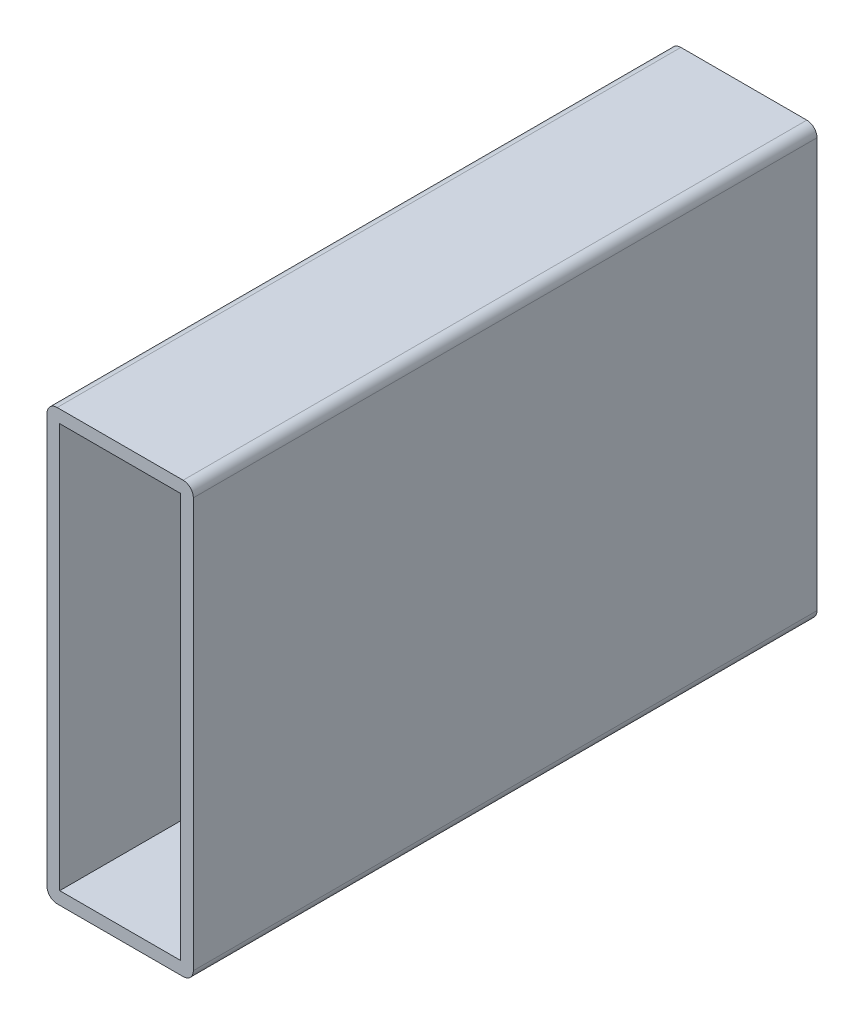
ISO-10303-21;
HEADER;
FILE_DESCRIPTION(('STEP AP214'),'2;1');
FILE_NAME('part.step','',(''),(''),'','','');
FILE_SCHEMA(('AUTOMOTIVE_DESIGN { 1 0 10303 214 1 1 1 1 }'));
ENDSEC;
DATA;
#1=APPLICATION_CONTEXT('core data for automotive mechanical design processes');
#2=APPLICATION_PROTOCOL_DEFINITION('international standard','automotive_design',2000,#1);
#3=PRODUCT_CONTEXT('',#1,'mechanical');
#4=PRODUCT('Part','Part','',(#3));
#5=PRODUCT_RELATED_PRODUCT_CATEGORY('part','',(#4));
#6=PRODUCT_DEFINITION_FORMATION('','',#4);
#7=PRODUCT_DEFINITION_CONTEXT('part definition',#1,'design');
#8=PRODUCT_DEFINITION('design','',#6,#7);
#9=PRODUCT_DEFINITION_SHAPE('','',#8);
#10=(LENGTH_UNIT() NAMED_UNIT(*) SI_UNIT(.MILLI.,.METRE.));
#11=(NAMED_UNIT(*) PLANE_ANGLE_UNIT() SI_UNIT($,.RADIAN.));
#12=(NAMED_UNIT(*) SI_UNIT($,.STERADIAN.) SOLID_ANGLE_UNIT());
#13=UNCERTAINTY_MEASURE_WITH_UNIT(LENGTH_MEASURE(1.E-05),#10,'distance_accuracy_value','');
#14=(GEOMETRIC_REPRESENTATION_CONTEXT(3) GLOBAL_UNCERTAINTY_ASSIGNED_CONTEXT((#13)) GLOBAL_UNIT_ASSIGNED_CONTEXT((#10,
#11,#12)) REPRESENTATION_CONTEXT('',''));
#15=CARTESIAN_POINT('',(0.,0.,0.));
#16=DIRECTION('',(0.,0.,1.));
#17=DIRECTION('',(1.,0.,0.));
#18=AXIS2_PLACEMENT_3D('',#15,#16,#17);
#19=CARTESIAN_POINT('',(36.5,0.,0.));
#20=DIRECTION('',(0.,0.,-1.));
#21=DIRECTION('',(-1.,0.,0.));
#22=AXIS2_PLACEMENT_3D('',#19,#20,#21);
#23=PLANE('',#22);
#24=DIRECTION('',(-1.,0.,0.));
#25=VECTOR('',#24,1.);
#26=CARTESIAN_POINT('',(36.5,0.,0.));
#27=LINE('',#26,#25);
#28=CARTESIAN_POINT('',(33.96,0.,0.));
#29=VERTEX_POINT('',#28);
#30=CARTESIAN_POINT('',(2.54,0.,0.));
#31=VERTEX_POINT('',#30);
#32=EDGE_CURVE('E251',#29,#31,#27,.T.);
#33=ORIENTED_EDGE('',*,*,#32,.F.);
#34=CARTESIAN_POINT('',(33.96,2.54,0.));
#35=DIRECTION('',(0.,0.,-1.));
#36=DIRECTION('',(-1.,0.,0.));
#37=AXIS2_PLACEMENT_3D('',#34,#35,#36);
#38=CIRCLE('',#37,2.54);
#39=CARTESIAN_POINT('',(36.5,2.54,0.));
#40=VERTEX_POINT('',#39);
#41=EDGE_CURVE('E279',#29,#40,#38,.F.);
#42=ORIENTED_EDGE('',*,*,#41,.T.);
#43=DIRECTION('',(0.,-1.,0.));
#44=VECTOR('',#43,1.);
#45=CARTESIAN_POINT('',(36.5,0.,0.));
#46=LINE('',#45,#44);
#47=CARTESIAN_POINT('',(36.5,104.697500028,0.));
#48=VERTEX_POINT('',#47);
#49=EDGE_CURVE('E231',#48,#40,#46,.T.);
#50=ORIENTED_EDGE('',*,*,#49,.F.);
#51=CARTESIAN_POINT('',(33.96,104.697500028,0.));
#52=DIRECTION('',(0.,0.,-1.));
#53=DIRECTION('',(-1.,0.,0.));
#54=AXIS2_PLACEMENT_3D('',#51,#52,#53);
#55=CIRCLE('',#54,2.54);
#56=CARTESIAN_POINT('',(33.96,107.237500028,0.));
#57=VERTEX_POINT('',#56);
#58=EDGE_CURVE('E273',#48,#57,#55,.F.);
#59=ORIENTED_EDGE('',*,*,#58,.T.);
#60=DIRECTION('',(-1.,0.,0.));
#61=VECTOR('',#60,1.);
#62=CARTESIAN_POINT('',(36.5,107.237500028,0.));
#63=LINE('',#62,#61);
#64=CARTESIAN_POINT('',(2.54,107.237500028,0.));
#65=VERTEX_POINT('',#64);
#66=EDGE_CURVE('E238',#57,#65,#63,.T.);
#67=ORIENTED_EDGE('',*,*,#66,.T.);
#68=CARTESIAN_POINT('',(2.54,104.697500028,0.));
#69=DIRECTION('',(0.,0.,-1.));
#70=DIRECTION('',(-1.,0.,0.));
#71=AXIS2_PLACEMENT_3D('',#68,#69,#70);
#72=CIRCLE('',#71,2.54);
#73=CARTESIAN_POINT('',(0.,104.697500028,0.));
#74=VERTEX_POINT('',#73);
#75=EDGE_CURVE('E275',#65,#74,#72,.F.);
#76=ORIENTED_EDGE('',*,*,#75,.T.);
#77=DIRECTION('',(0.,-1.,0.));
#78=VECTOR('',#77,1.);
#79=CARTESIAN_POINT('',(0.,0.,0.));
#80=LINE('',#79,#78);
#81=CARTESIAN_POINT('',(0.,2.54,0.));
#82=VERTEX_POINT('',#81);
#83=EDGE_CURVE('E224',#74,#82,#80,.T.);
#84=ORIENTED_EDGE('',*,*,#83,.T.);
#85=CARTESIAN_POINT('',(2.54,2.54,0.));
#86=DIRECTION('',(0.,0.,-1.));
#87=DIRECTION('',(-1.,0.,0.));
#88=AXIS2_PLACEMENT_3D('',#85,#86,#87);
#89=CIRCLE('',#88,2.54);
#90=EDGE_CURVE('E277',#82,#31,#89,.F.);
#91=ORIENTED_EDGE('',*,*,#90,.T.);
#92=EDGE_LOOP('',(#33,#42,#50,#59,#67,#76,#84,#91));
#93=FACE_BOUND('',#92,.T.);
#94=DIRECTION('',(0.,-1.,0.));
#95=VECTOR('',#94,1.);
#96=CARTESIAN_POINT('',(3.175,0.,0.));
#97=LINE('',#96,#95);
#98=CARTESIAN_POINT('',(3.175,104.062500028,0.));
#99=VERTEX_POINT('',#98);
#100=CARTESIAN_POINT('',(3.175,3.175,0.));
#101=VERTEX_POINT('',#100);
#102=EDGE_CURVE('E158',#99,#101,#97,.T.);
#103=ORIENTED_EDGE('',*,*,#102,.F.);
#104=DIRECTION('',(-1.,0.,0.));
#105=VECTOR('',#104,1.);
#106=CARTESIAN_POINT('',(36.5,104.062500028,0.));
#107=LINE('',#106,#105);
#108=CARTESIAN_POINT('',(33.325,104.062500028,0.));
#109=VERTEX_POINT('',#108);
#110=EDGE_CURVE('E216',#109,#99,#107,.T.);
#111=ORIENTED_EDGE('',*,*,#110,.F.);
#112=DIRECTION('',(0.,-1.,0.));
#113=VECTOR('',#112,1.);
#114=CARTESIAN_POINT('',(33.325,0.,0.));
#115=LINE('',#114,#113);
#116=CARTESIAN_POINT('',(33.325,3.175,0.));
#117=VERTEX_POINT('',#116);
#118=EDGE_CURVE('E211',#109,#117,#115,.T.);
#119=ORIENTED_EDGE('',*,*,#118,.T.);
#120=DIRECTION('',(-1.,0.,0.));
#121=VECTOR('',#120,1.);
#122=CARTESIAN_POINT('',(36.5,3.175,0.));
#123=LINE('',#122,#121);
#124=EDGE_CURVE('E206',#117,#101,#123,.T.);
#125=ORIENTED_EDGE('',*,*,#124,.T.);
#126=EDGE_LOOP('',(#103,#111,#119,#125));
#127=FACE_BOUND('',#126,.T.);
#128=ADVANCED_FACE('F39',(#93,#127),#23,.F.);
#129=CARTESIAN_POINT('',(36.5,0.,0.));
#130=DIRECTION('',(0.,1.,0.));
#131=DIRECTION('',(0.,0.,1.));
#132=AXIS2_PLACEMENT_3D('',#129,#130,#131);
#133=PLANE('',#132);
#134=DIRECTION('',(-1.,0.,0.));
#135=VECTOR('',#134,1.);
#136=CARTESIAN_POINT('',(36.5,0.,-155.575));
#137=LINE('',#136,#135);
#138=CARTESIAN_POINT('',(33.96,0.,-155.575));
#139=VERTEX_POINT('',#138);
#140=CARTESIAN_POINT('',(2.54,0.,-155.575));
#141=VERTEX_POINT('',#140);
#142=EDGE_CURVE('E248',#139,#141,#137,.T.);
#143=ORIENTED_EDGE('',*,*,#142,.F.);
#144=DIRECTION('',(0.,0.,-1.));
#145=VECTOR('',#144,1.);
#146=CARTESIAN_POINT('',(33.96,0.,0.));
#147=LINE('',#146,#145);
#148=EDGE_CURVE('E271',#139,#29,#147,.F.);
#149=ORIENTED_EDGE('',*,*,#148,.T.);
#150=ORIENTED_EDGE('',*,*,#32,.T.);
#151=DIRECTION('',(0.,0.,-1.));
#152=VECTOR('',#151,1.);
#153=CARTESIAN_POINT('',(2.54,0.,-155.575));
#154=LINE('',#153,#152);
#155=EDGE_CURVE('E268',#31,#141,#154,.T.);
#156=ORIENTED_EDGE('',*,*,#155,.T.);
#157=EDGE_LOOP('',(#143,#149,#150,#156));
#158=FACE_BOUND('',#157,.T.);
#159=ADVANCED_FACE('F310',(#158),#133,.F.);
#160=CARTESIAN_POINT('',(36.5,0.,-155.575));
#161=DIRECTION('',(0.,0.,1.));
#162=DIRECTION('',(1.,0.,0.));
#163=AXIS2_PLACEMENT_3D('',#160,#161,#162);
#164=PLANE('',#163);
#165=CARTESIAN_POINT('',(7.175,25.4,-155.575));
#166=DIRECTION('',(0.,0.,1.));
#167=DIRECTION('',(1.,0.,0.));
#168=AXIS2_PLACEMENT_3D('',#165,#166,#167);
#169=CIRCLE('',#168,2.38125);
#170=CARTESIAN_POINT('',(9.55625,25.4,-155.575));
#171=VERTEX_POINT('',#170);
#172=EDGE_CURVE('E199',#171,#171,#169,.T.);
#173=ORIENTED_EDGE('',*,*,#172,.T.);
#174=EDGE_LOOP('',(#173));
#175=FACE_BOUND('',#174,.T.);
#176=DIRECTION('',(1.,0.,0.));
#177=VECTOR('',#176,1.);
#178=CARTESIAN_POINT('',(13.175,35.,-155.575));
#179=LINE('',#178,#177);
#180=CARTESIAN_POINT('',(13.175,35.,-155.575));
#181=VERTEX_POINT('',#180);
#182=CARTESIAN_POINT('',(28.175,35.,-155.575));
#183=VERTEX_POINT('',#182);
#184=EDGE_CURVE('E171',#181,#183,#179,.T.);
#185=ORIENTED_EDGE('',*,*,#184,.F.);
#186=DIRECTION('',(0.,1.,0.));
#187=VECTOR('',#186,1.);
#188=CARTESIAN_POINT('',(13.175,35.,-155.575));
#189=LINE('',#188,#187);
#190=CARTESIAN_POINT('',(13.175,20.,-155.575));
#191=VERTEX_POINT('',#190);
#192=EDGE_CURVE('E54',#191,#181,#189,.T.);
#193=ORIENTED_EDGE('',*,*,#192,.F.);
#194=DIRECTION('',(-1.,0.,0.));
#195=VECTOR('',#194,1.);
#196=CARTESIAN_POINT('',(13.175,20.,-155.575));
#197=LINE('',#196,#195);
#198=CARTESIAN_POINT('',(28.175,20.,-155.575));
#199=VERTEX_POINT('',#198);
#200=EDGE_CURVE('E164',#199,#191,#197,.T.);
#201=ORIENTED_EDGE('',*,*,#200,.F.);
#202=DIRECTION('',(0.,-1.,0.));
#203=VECTOR('',#202,1.);
#204=CARTESIAN_POINT('',(28.175,35.,-155.575));
#205=LINE('',#204,#203);
#206=EDGE_CURVE('E178',#183,#199,#205,.T.);
#207=ORIENTED_EDGE('',*,*,#206,.F.);
#208=EDGE_LOOP('',(#185,#193,#201,#207));
#209=FACE_BOUND('',#208,.T.);
#210=CARTESIAN_POINT('',(7.175,30.,-155.575));
#211=DIRECTION('',(0.,0.,-1.));
#212=DIRECTION('',(-1.,0.,0.));
#213=AXIS2_PLACEMENT_3D('',#210,#211,#212);
#214=CIRCLE('',#213,1.19999999999999);
#215=CARTESIAN_POINT('',(5.97500000000001,30.,-155.575));
#216=VERTEX_POINT('',#215);
#217=EDGE_CURVE('E190',#216,#216,#214,.T.);
#218=ORIENTED_EDGE('',*,*,#217,.F.);
#219=EDGE_LOOP('',(#218));
#220=FACE_BOUND('',#219,.T.);
#221=CARTESIAN_POINT('',(7.175,4.99999999999999,-155.575));
#222=DIRECTION('',(0.,0.,-1.));
#223=DIRECTION('',(-1.,0.,0.));
#224=AXIS2_PLACEMENT_3D('',#221,#222,#223);
#225=CIRCLE('',#224,1.19999999999999);
#226=CARTESIAN_POINT('',(5.97500000000001,4.99999999999999,-155.575));
#227=VERTEX_POINT('',#226);
#228=EDGE_CURVE('E196',#227,#227,#225,.T.);
#229=ORIENTED_EDGE('',*,*,#228,.F.);
#230=EDGE_LOOP('',(#229));
#231=FACE_BOUND('',#230,.T.);
#232=DIRECTION('',(0.,1.,0.));
#233=VECTOR('',#232,1.);
#234=CARTESIAN_POINT('',(36.5,0.,-155.575));
#235=LINE('',#234,#233);
#236=CARTESIAN_POINT('',(36.5,2.54,-155.575));
#237=VERTEX_POINT('',#236);
#238=CARTESIAN_POINT('',(36.5,104.697500028,-155.575));
#239=VERTEX_POINT('',#238);
#240=EDGE_CURVE('E234',#237,#239,#235,.T.);
#241=ORIENTED_EDGE('',*,*,#240,.F.);
#242=CARTESIAN_POINT('',(33.96,2.54,-155.575));
#243=DIRECTION('',(0.,0.,1.));
#244=DIRECTION('',(1.,0.,0.));
#245=AXIS2_PLACEMENT_3D('',#242,#243,#244);
#246=CIRCLE('',#245,2.54);
#247=EDGE_CURVE('E266',#237,#139,#246,.F.);
#248=ORIENTED_EDGE('',*,*,#247,.T.);
#249=ORIENTED_EDGE('',*,*,#142,.T.);
#250=CARTESIAN_POINT('',(2.54,2.54,-155.575));
#251=DIRECTION('',(0.,0.,1.));
#252=DIRECTION('',(1.,0.,0.));
#253=AXIS2_PLACEMENT_3D('',#250,#251,#252);
#254=CIRCLE('',#253,2.54);
#255=CARTESIAN_POINT('',(0.,2.54,-155.575));
#256=VERTEX_POINT('',#255);
#257=EDGE_CURVE('E264',#141,#256,#254,.F.);
#258=ORIENTED_EDGE('',*,*,#257,.T.);
#259=DIRECTION('',(0.,1.,0.));
#260=VECTOR('',#259,1.);
#261=CARTESIAN_POINT('',(0.,0.,-155.575));
#262=LINE('',#261,#260);
#263=CARTESIAN_POINT('',(0.,104.697500028,-155.575));
#264=VERTEX_POINT('',#263);
#265=EDGE_CURVE('E235',#256,#264,#262,.T.);
#266=ORIENTED_EDGE('',*,*,#265,.T.);
#267=CARTESIAN_POINT('',(2.54,104.697500028,-155.575));
#268=DIRECTION('',(0.,0.,1.));
#269=DIRECTION('',(1.,0.,0.));
#270=AXIS2_PLACEMENT_3D('',#267,#268,#269);
#271=CIRCLE('',#270,2.54);
#272=CARTESIAN_POINT('',(2.54,107.237500028,-155.575));
#273=VERTEX_POINT('',#272);
#274=EDGE_CURVE('E262',#264,#273,#271,.F.);
#275=ORIENTED_EDGE('',*,*,#274,.T.);
#276=DIRECTION('',(-1.,0.,0.));
#277=VECTOR('',#276,1.);
#278=CARTESIAN_POINT('',(36.5,107.237500028,-155.575));
#279=LINE('',#278,#277);
#280=CARTESIAN_POINT('',(33.96,107.237500028,-155.575));
#281=VERTEX_POINT('',#280);
#282=EDGE_CURVE('E245',#281,#273,#279,.T.);
#283=ORIENTED_EDGE('',*,*,#282,.F.);
#284=CARTESIAN_POINT('',(33.96,104.697500028,-155.575));
#285=DIRECTION('',(0.,0.,1.));
#286=DIRECTION('',(1.,0.,0.));
#287=AXIS2_PLACEMENT_3D('',#284,#285,#286);
#288=CIRCLE('',#287,2.54);
#289=EDGE_CURVE('E260',#281,#239,#288,.F.);
#290=ORIENTED_EDGE('',*,*,#289,.T.);
#291=EDGE_LOOP('',(#241,#248,#249,#258,#266,#275,#283,#290));
#292=FACE_BOUND('',#291,.T.);
#293=ADVANCED_FACE('F294',(#175,#209,#220,#231,#292),#164,.F.);
#294=CARTESIAN_POINT('',(36.5,107.237500028,0.));
#295=DIRECTION('',(0.,-1.,0.));
#296=DIRECTION('',(0.,0.,-1.));
#297=AXIS2_PLACEMENT_3D('',#294,#295,#296);
#298=PLANE('',#297);
#299=ORIENTED_EDGE('',*,*,#282,.T.);
#300=DIRECTION('',(0.,0.,1.));
#301=VECTOR('',#300,1.);
#302=CARTESIAN_POINT('',(2.54,107.237500028,0.));
#303=LINE('',#302,#301);
#304=EDGE_CURVE('E11',#273,#65,#303,.T.);
#305=ORIENTED_EDGE('',*,*,#304,.T.);
#306=ORIENTED_EDGE('',*,*,#66,.F.);
#307=DIRECTION('',(0.,0.,1.));
#308=VECTOR('',#307,1.);
#309=CARTESIAN_POINT('',(33.96,107.237500028,0.));
#310=LINE('',#309,#308);
#311=EDGE_CURVE('E47',#57,#281,#310,.F.);
#312=ORIENTED_EDGE('',*,*,#311,.T.);
#313=EDGE_LOOP('',(#299,#305,#306,#312));
#314=FACE_BOUND('',#313,.T.);
#315=ADVANCED_FACE('F288',(#314),#298,.F.);
#316=CARTESIAN_POINT('',(36.5,0.,0.));
#317=DIRECTION('',(-1.,0.,0.));
#318=DIRECTION('',(0.,0.,1.));
#319=AXIS2_PLACEMENT_3D('',#316,#317,#318);
#320=PLANE('',#319);
#321=ORIENTED_EDGE('',*,*,#49,.T.);
#322=DIRECTION('',(0.,0.,-1.));
#323=VECTOR('',#322,1.);
#324=CARTESIAN_POINT('',(36.5,2.54,0.));
#325=LINE('',#324,#323);
#326=EDGE_CURVE('E257',#40,#237,#325,.T.);
#327=ORIENTED_EDGE('',*,*,#326,.T.);
#328=ORIENTED_EDGE('',*,*,#240,.T.);
#329=DIRECTION('',(0.,0.,1.));
#330=VECTOR('',#329,1.);
#331=CARTESIAN_POINT('',(36.5,104.697500028,0.));
#332=LINE('',#331,#330);
#333=EDGE_CURVE('E254',#239,#48,#332,.T.);
#334=ORIENTED_EDGE('',*,*,#333,.T.);
#335=EDGE_LOOP('',(#321,#327,#328,#334));
#336=FACE_BOUND('',#335,.T.);
#337=ADVANCED_FACE('F299',(#336),#320,.F.);
#338=CARTESIAN_POINT('',(0.,0.,0.));
#339=DIRECTION('',(-1.,0.,0.));
#340=DIRECTION('',(0.,0.,1.));
#341=AXIS2_PLACEMENT_3D('',#338,#339,#340);
#342=PLANE('',#341);
#343=ORIENTED_EDGE('',*,*,#265,.F.);
#344=DIRECTION('',(0.,0.,-1.));
#345=VECTOR('',#344,1.);
#346=CARTESIAN_POINT('',(0.,2.54,0.));
#347=LINE('',#346,#345);
#348=EDGE_CURVE('E283',#256,#82,#347,.F.);
#349=ORIENTED_EDGE('',*,*,#348,.T.);
#350=ORIENTED_EDGE('',*,*,#83,.F.);
#351=DIRECTION('',(0.,0.,1.));
#352=VECTOR('',#351,1.);
#353=CARTESIAN_POINT('',(0.,104.697500028,-155.575));
#354=LINE('',#353,#352);
#355=EDGE_CURVE('E281',#74,#264,#354,.F.);
#356=ORIENTED_EDGE('',*,*,#355,.T.);
#357=EDGE_LOOP('',(#343,#349,#350,#356));
#358=FACE_BOUND('',#357,.T.);
#359=ADVANCED_FACE('F318',(#358),#342,.T.);
#360=CARTESIAN_POINT('',(36.5,3.175,0.));
#361=DIRECTION('',(0.,1.,0.));
#362=DIRECTION('',(0.,0.,1.));
#363=AXIS2_PLACEMENT_3D('',#360,#361,#362);
#364=PLANE('',#363);
#365=DIRECTION('',(0.,0.,-1.));
#366=VECTOR('',#365,1.);
#367=CARTESIAN_POINT('',(3.175,3.175,0.));
#368=LINE('',#367,#366);
#369=CARTESIAN_POINT('',(3.175,3.175,-152.4));
#370=VERTEX_POINT('',#369);
#371=EDGE_CURVE('E200',#101,#370,#368,.T.);
#372=ORIENTED_EDGE('',*,*,#371,.F.);
#373=ORIENTED_EDGE('',*,*,#124,.F.);
#374=DIRECTION('',(0.,0.,-1.));
#375=VECTOR('',#374,1.);
#376=CARTESIAN_POINT('',(33.325,3.175,0.));
#377=LINE('',#376,#375);
#378=CARTESIAN_POINT('',(33.325,3.175,-152.4));
#379=VERTEX_POINT('',#378);
#380=EDGE_CURVE('E208',#117,#379,#377,.T.);
#381=ORIENTED_EDGE('',*,*,#380,.T.);
#382=DIRECTION('',(-1.,0.,0.));
#383=VECTOR('',#382,1.);
#384=CARTESIAN_POINT('',(36.5,3.175,-152.4));
#385=LINE('',#384,#383);
#386=EDGE_CURVE('E203',#379,#370,#385,.T.);
#387=ORIENTED_EDGE('',*,*,#386,.T.);
#388=EDGE_LOOP('',(#372,#373,#381,#387));
#389=FACE_BOUND('',#388,.T.);
#390=ADVANCED_FACE('F358',(#389),#364,.T.);
#391=CARTESIAN_POINT('',(36.5,0.,-152.4));
#392=DIRECTION('',(0.,0.,1.));
#393=DIRECTION('',(1.,0.,0.));
#394=AXIS2_PLACEMENT_3D('',#391,#392,#393);
#395=PLANE('',#394);
#396=CARTESIAN_POINT('',(7.175,25.4,-152.4));
#397=DIRECTION('',(0.,0.,1.));
#398=DIRECTION('',(1.,0.,0.));
#399=AXIS2_PLACEMENT_3D('',#396,#397,#398);
#400=CIRCLE('',#399,2.38125);
#401=CARTESIAN_POINT('',(9.55625,25.4,-152.4));
#402=VERTEX_POINT('',#401);
#403=EDGE_CURVE('E540',#402,#402,#400,.T.);
#404=ORIENTED_EDGE('',*,*,#403,.F.);
#405=EDGE_LOOP('',(#404));
#406=FACE_BOUND('',#405,.T.);
#407=DIRECTION('',(0.,1.,0.));
#408=VECTOR('',#407,1.);
#409=CARTESIAN_POINT('',(13.175,35.,-152.4));
#410=LINE('',#409,#408);
#411=CARTESIAN_POINT('',(13.175,20.,-152.4));
#412=VERTEX_POINT('',#411);
#413=CARTESIAN_POINT('',(13.175,35.,-152.4));
#414=VERTEX_POINT('',#413);
#415=EDGE_CURVE('E162',#412,#414,#410,.T.);
#416=ORIENTED_EDGE('',*,*,#415,.T.);
#417=DIRECTION('',(1.,0.,0.));
#418=VECTOR('',#417,1.);
#419=CARTESIAN_POINT('',(13.175,35.,-152.4));
#420=LINE('',#419,#418);
#421=CARTESIAN_POINT('',(28.175,35.,-152.4));
#422=VERTEX_POINT('',#421);
#423=EDGE_CURVE('E151',#414,#422,#420,.T.);
#424=ORIENTED_EDGE('',*,*,#423,.T.);
#425=DIRECTION('',(0.,-1.,0.));
#426=VECTOR('',#425,1.);
#427=CARTESIAN_POINT('',(28.175,35.,-152.4));
#428=LINE('',#427,#426);
#429=CARTESIAN_POINT('',(28.175,20.,-152.4));
#430=VERTEX_POINT('',#429);
#431=EDGE_CURVE('E173',#422,#430,#428,.T.);
#432=ORIENTED_EDGE('',*,*,#431,.T.);
#433=DIRECTION('',(-1.,0.,0.));
#434=VECTOR('',#433,1.);
#435=CARTESIAN_POINT('',(13.175,20.,-152.4));
#436=LINE('',#435,#434);
#437=EDGE_CURVE('E169',#430,#412,#436,.T.);
#438=ORIENTED_EDGE('',*,*,#437,.T.);
#439=EDGE_LOOP('',(#416,#424,#432,#438));
#440=FACE_BOUND('',#439,.T.);
#441=CARTESIAN_POINT('',(7.175,30.,-152.4));
#442=DIRECTION('',(0.,0.,1.));
#443=DIRECTION('',(1.,0.,0.));
#444=AXIS2_PLACEMENT_3D('',#441,#442,#443);
#445=CIRCLE('',#444,1.19999999999999);
#446=CARTESIAN_POINT('',(8.37499999999999,30.,-152.4));
#447=VERTEX_POINT('',#446);
#448=EDGE_CURVE('E187',#447,#447,#445,.F.);
#449=ORIENTED_EDGE('',*,*,#448,.T.);
#450=EDGE_LOOP('',(#449));
#451=FACE_BOUND('',#450,.T.);
#452=CARTESIAN_POINT('',(7.175,4.99999999999999,-152.4));
#453=DIRECTION('',(0.,0.,1.));
#454=DIRECTION('',(1.,0.,0.));
#455=AXIS2_PLACEMENT_3D('',#452,#453,#454);
#456=CIRCLE('',#455,1.19999999999999);
#457=CARTESIAN_POINT('',(8.37499999999998,4.99999999999999,-152.4));
#458=VERTEX_POINT('',#457);
#459=EDGE_CURVE('E193',#458,#458,#456,.F.);
#460=ORIENTED_EDGE('',*,*,#459,.T.);
#461=EDGE_LOOP('',(#460));
#462=FACE_BOUND('',#461,.T.);
#463=DIRECTION('',(0.,1.,0.));
#464=VECTOR('',#463,1.);
#465=CARTESIAN_POINT('',(3.175,0.,-152.4));
#466=LINE('',#465,#464);
#467=CARTESIAN_POINT('',(3.175,104.062500028,-152.4));
#468=VERTEX_POINT('',#467);
#469=EDGE_CURVE('E202',#370,#468,#466,.T.);
#470=ORIENTED_EDGE('',*,*,#469,.F.);
#471=ORIENTED_EDGE('',*,*,#386,.F.);
#472=DIRECTION('',(0.,1.,0.));
#473=VECTOR('',#472,1.);
#474=CARTESIAN_POINT('',(33.325,0.,-152.4));
#475=LINE('',#474,#473);
#476=CARTESIAN_POINT('',(33.325,104.062500028,-152.4));
#477=VERTEX_POINT('',#476);
#478=EDGE_CURVE('E210',#379,#477,#475,.T.);
#479=ORIENTED_EDGE('',*,*,#478,.T.);
#480=DIRECTION('',(-1.,0.,0.));
#481=VECTOR('',#480,1.);
#482=CARTESIAN_POINT('',(36.5,104.062500028,-152.4));
#483=LINE('',#482,#481);
#484=EDGE_CURVE('E207',#477,#468,#483,.T.);
#485=ORIENTED_EDGE('',*,*,#484,.T.);
#486=EDGE_LOOP('',(#470,#471,#479,#485));
#487=FACE_BOUND('',#486,.T.);
#488=ADVANCED_FACE('F167',(#406,#440,#451,#462,#487),#395,.T.);
#489=CARTESIAN_POINT('',(36.5,104.062500028,0.));
#490=DIRECTION('',(0.,-1.,0.));
#491=DIRECTION('',(0.,0.,-1.));
#492=AXIS2_PLACEMENT_3D('',#489,#490,#491);
#493=PLANE('',#492);
#494=DIRECTION('',(0.,0.,1.));
#495=VECTOR('',#494,1.);
#496=CARTESIAN_POINT('',(3.175,104.062500028,0.));
#497=LINE('',#496,#495);
#498=EDGE_CURVE('E213',#468,#99,#497,.T.);
#499=ORIENTED_EDGE('',*,*,#498,.F.);
#500=ORIENTED_EDGE('',*,*,#484,.F.);
#501=DIRECTION('',(0.,0.,1.));
#502=VECTOR('',#501,1.);
#503=CARTESIAN_POINT('',(33.325,104.062500028,0.));
#504=LINE('',#503,#502);
#505=EDGE_CURVE('E218',#477,#109,#504,.T.);
#506=ORIENTED_EDGE('',*,*,#505,.T.);
#507=ORIENTED_EDGE('',*,*,#110,.T.);
#508=EDGE_LOOP('',(#499,#500,#506,#507));
#509=FACE_BOUND('',#508,.T.);
#510=ADVANCED_FACE('F350',(#509),#493,.T.);
#511=CARTESIAN_POINT('',(33.325,0.,0.));
#512=DIRECTION('',(-1.,0.,0.));
#513=DIRECTION('',(0.,0.,1.));
#514=AXIS2_PLACEMENT_3D('',#511,#512,#513);
#515=PLANE('',#514);
#516=ORIENTED_EDGE('',*,*,#118,.F.);
#517=ORIENTED_EDGE('',*,*,#505,.F.);
#518=ORIENTED_EDGE('',*,*,#478,.F.);
#519=ORIENTED_EDGE('',*,*,#380,.F.);
#520=EDGE_LOOP('',(#516,#517,#518,#519));
#521=FACE_BOUND('',#520,.T.);
#522=ADVANCED_FACE('F344',(#521),#515,.T.);
#523=CARTESIAN_POINT('',(3.175,0.,0.));
#524=DIRECTION('',(-1.,0.,0.));
#525=DIRECTION('',(0.,0.,1.));
#526=AXIS2_PLACEMENT_3D('',#523,#524,#525);
#527=PLANE('',#526);
#528=ORIENTED_EDGE('',*,*,#102,.T.);
#529=ORIENTED_EDGE('',*,*,#371,.T.);
#530=ORIENTED_EDGE('',*,*,#469,.T.);
#531=ORIENTED_EDGE('',*,*,#498,.T.);
#532=EDGE_LOOP('',(#528,#529,#530,#531));
#533=FACE_BOUND('',#532,.T.);
#534=ADVANCED_FACE('F340',(#533),#527,.F.);
#535=CARTESIAN_POINT('',(33.96,2.54,0.));
#536=DIRECTION('',(0.,0.,-1.));
#537=DIRECTION('',(-1.,0.,0.));
#538=AXIS2_PLACEMENT_3D('',#535,#536,#537);
#539=CYLINDRICAL_SURFACE('',#538,2.54);
#540=ORIENTED_EDGE('',*,*,#41,.F.);
#541=ORIENTED_EDGE('',*,*,#148,.F.);
#542=ORIENTED_EDGE('',*,*,#247,.F.);
#543=ORIENTED_EDGE('',*,*,#326,.F.);
#544=EDGE_LOOP('',(#540,#541,#542,#543));
#545=FACE_BOUND('',#544,.T.);
#546=ADVANCED_FACE('F307',(#545),#539,.T.);
#547=CARTESIAN_POINT('',(2.54,2.54,0.));
#548=DIRECTION('',(0.,0.,1.));
#549=DIRECTION('',(1.,0.,0.));
#550=AXIS2_PLACEMENT_3D('',#547,#548,#549);
#551=CYLINDRICAL_SURFACE('',#550,2.54);
#552=ORIENTED_EDGE('',*,*,#90,.F.);
#553=ORIENTED_EDGE('',*,*,#348,.F.);
#554=ORIENTED_EDGE('',*,*,#257,.F.);
#555=ORIENTED_EDGE('',*,*,#155,.F.);
#556=EDGE_LOOP('',(#552,#553,#554,#555));
#557=FACE_BOUND('',#556,.T.);
#558=ADVANCED_FACE('F314',(#557),#551,.T.);
#559=CARTESIAN_POINT('',(2.54,104.697500028,0.));
#560=DIRECTION('',(0.,0.,-1.));
#561=DIRECTION('',(-1.,0.,0.));
#562=AXIS2_PLACEMENT_3D('',#559,#560,#561);
#563=CYLINDRICAL_SURFACE('',#562,2.54);
#564=ORIENTED_EDGE('',*,*,#274,.F.);
#565=ORIENTED_EDGE('',*,*,#355,.F.);
#566=ORIENTED_EDGE('',*,*,#75,.F.);
#567=ORIENTED_EDGE('',*,*,#304,.F.);
#568=EDGE_LOOP('',(#564,#565,#566,#567));
#569=FACE_BOUND('',#568,.T.);
#570=ADVANCED_FACE('F322',(#569),#563,.T.);
#571=CARTESIAN_POINT('',(33.96,104.697500028,0.));
#572=DIRECTION('',(0.,0.,1.));
#573=DIRECTION('',(1.,0.,0.));
#574=AXIS2_PLACEMENT_3D('',#571,#572,#573);
#575=CYLINDRICAL_SURFACE('',#574,2.54);
#576=ORIENTED_EDGE('',*,*,#289,.F.);
#577=ORIENTED_EDGE('',*,*,#311,.F.);
#578=ORIENTED_EDGE('',*,*,#58,.F.);
#579=ORIENTED_EDGE('',*,*,#333,.F.);
#580=EDGE_LOOP('',(#576,#577,#578,#579));
#581=FACE_BOUND('',#580,.T.);
#582=ADVANCED_FACE('F41',(#581),#575,.T.);
#583=CARTESIAN_POINT('',(7.175,4.99999999999999,0.001000000000001));
#584=DIRECTION('',(0.,0.,-1.));
#585=DIRECTION('',(-1.,0.,0.));
#586=AXIS2_PLACEMENT_3D('',#583,#584,#585);
#587=CYLINDRICAL_SURFACE('',#586,1.19999999999999);
#588=ORIENTED_EDGE('',*,*,#459,.F.);
#589=EDGE_LOOP('',(#588));
#590=FACE_BOUND('',#589,.T.);
#591=ORIENTED_EDGE('',*,*,#228,.T.);
#592=EDGE_LOOP('',(#591));
#593=FACE_BOUND('',#592,.T.);
#594=ADVANCED_FACE('F328',(#590,#593),#587,.F.);
#595=CARTESIAN_POINT('',(7.175,30.,0.001000000000001));
#596=DIRECTION('',(0.,0.,-1.));
#597=DIRECTION('',(-1.,0.,0.));
#598=AXIS2_PLACEMENT_3D('',#595,#596,#597);
#599=CYLINDRICAL_SURFACE('',#598,1.19999999999999);
#600=ORIENTED_EDGE('',*,*,#448,.F.);
#601=EDGE_LOOP('',(#600));
#602=FACE_BOUND('',#601,.T.);
#603=ORIENTED_EDGE('',*,*,#217,.T.);
#604=EDGE_LOOP('',(#603));
#605=FACE_BOUND('',#604,.T.);
#606=ADVANCED_FACE('F376',(#602,#605),#599,.F.);
#607=CARTESIAN_POINT('',(13.175,35.,0.001000000000001));
#608=DIRECTION('',(-1.,0.,0.));
#609=DIRECTION('',(0.,-1.,0.));
#610=AXIS2_PLACEMENT_3D('',#607,#608,#609);
#611=PLANE('',#610);
#612=DIRECTION('',(0.,0.,-1.));
#613=VECTOR('',#612,1.);
#614=CARTESIAN_POINT('',(13.175,20.,0.001000000000001));
#615=LINE('',#614,#613);
#616=EDGE_CURVE('E159',#412,#191,#615,.T.);
#617=ORIENTED_EDGE('',*,*,#616,.T.);
#618=ORIENTED_EDGE('',*,*,#192,.T.);
#619=DIRECTION('',(0.,0.,-1.));
#620=VECTOR('',#619,1.);
#621=CARTESIAN_POINT('',(13.175,35.,0.001000000000001));
#622=LINE('',#621,#620);
#623=EDGE_CURVE('E153',#414,#181,#622,.T.);
#624=ORIENTED_EDGE('',*,*,#623,.F.);
#625=ORIENTED_EDGE('',*,*,#415,.F.);
#626=EDGE_LOOP('',(#617,#618,#624,#625));
#627=FACE_BOUND('',#626,.T.);
#628=ADVANCED_FACE('F161',(#627),#611,.F.);
#629=CARTESIAN_POINT('',(13.175,20.,0.001000000000001));
#630=DIRECTION('',(0.,-1.,0.));
#631=DIRECTION('',(1.,0.,0.));
#632=AXIS2_PLACEMENT_3D('',#629,#630,#631);
#633=PLANE('',#632);
#634=DIRECTION('',(0.,0.,-1.));
#635=VECTOR('',#634,1.);
#636=CARTESIAN_POINT('',(28.175,20.,0.001000000000001));
#637=LINE('',#636,#635);
#638=EDGE_CURVE('E184',#430,#199,#637,.T.);
#639=ORIENTED_EDGE('',*,*,#638,.T.);
#640=ORIENTED_EDGE('',*,*,#200,.T.);
#641=ORIENTED_EDGE('',*,*,#616,.F.);
#642=ORIENTED_EDGE('',*,*,#437,.F.);
#643=EDGE_LOOP('',(#639,#640,#641,#642));
#644=FACE_BOUND('',#643,.T.);
#645=ADVANCED_FACE('F457',(#644),#633,.F.);
#646=CARTESIAN_POINT('',(28.175,35.,0.001000000000001));
#647=DIRECTION('',(1.,0.,0.));
#648=DIRECTION('',(0.,1.,0.));
#649=AXIS2_PLACEMENT_3D('',#646,#647,#648);
#650=PLANE('',#649);
#651=DIRECTION('',(0.,0.,-1.));
#652=VECTOR('',#651,1.);
#653=CARTESIAN_POINT('',(28.175,35.,0.001000000000001));
#654=LINE('',#653,#652);
#655=EDGE_CURVE('E62',#422,#183,#654,.T.);
#656=ORIENTED_EDGE('',*,*,#655,.T.);
#657=ORIENTED_EDGE('',*,*,#206,.T.);
#658=ORIENTED_EDGE('',*,*,#638,.F.);
#659=ORIENTED_EDGE('',*,*,#431,.F.);
#660=EDGE_LOOP('',(#656,#657,#658,#659));
#661=FACE_BOUND('',#660,.T.);
#662=ADVANCED_FACE('F465',(#661),#650,.F.);
#663=CARTESIAN_POINT('',(13.175,35.,0.001000000000001));
#664=DIRECTION('',(0.,1.,0.));
#665=DIRECTION('',(0.,0.,1.));
#666=AXIS2_PLACEMENT_3D('',#663,#664,#665);
#667=PLANE('',#666);
#668=ORIENTED_EDGE('',*,*,#623,.T.);
#669=ORIENTED_EDGE('',*,*,#184,.T.);
#670=ORIENTED_EDGE('',*,*,#655,.F.);
#671=ORIENTED_EDGE('',*,*,#423,.F.);
#672=EDGE_LOOP('',(#668,#669,#670,#671));
#673=FACE_BOUND('',#672,.T.);
#674=ADVANCED_FACE('F152',(#673),#667,.F.);
#675=CARTESIAN_POINT('',(7.175,25.4,-155.575));
#676=DIRECTION('',(0.,0.,1.));
#677=DIRECTION('',(1.,0.,0.));
#678=AXIS2_PLACEMENT_3D('',#675,#676,#677);
#679=CYLINDRICAL_SURFACE('',#678,2.38125);
#680=CARTESIAN_POINT('',(9.55625,25.4,-155.575));
#681=CARTESIAN_POINT('',(9.55625,25.4,-155.541927083333));
#682=CARTESIAN_POINT('',(9.55625,25.4,-155.508854166667));
#683=CARTESIAN_POINT('',(9.55625,25.4,-155.442708333333));
#684=CARTESIAN_POINT('',(9.55625,25.4,-155.409635416667));
#685=CARTESIAN_POINT('',(9.55625,25.4,-155.343489583333));
#686=CARTESIAN_POINT('',(9.55625,25.4,-155.310416666667));
#687=CARTESIAN_POINT('',(9.55625,25.4,-155.244270833333));
#688=CARTESIAN_POINT('',(9.55625,25.4,-155.211197916667));
#689=CARTESIAN_POINT('',(9.55625,25.4,-155.145052083333));
#690=CARTESIAN_POINT('',(9.55625,25.4,-155.111979166667));
#691=CARTESIAN_POINT('',(9.55625,25.4,-155.045833333333));
#692=CARTESIAN_POINT('',(9.55625,25.4,-155.012760416667));
#693=CARTESIAN_POINT('',(9.55625,25.4,-154.946614583333));
#694=CARTESIAN_POINT('',(9.55625,25.4,-154.913541666667));
#695=CARTESIAN_POINT('',(9.55625,25.4,-154.847395833333));
#696=CARTESIAN_POINT('',(9.55625,25.4,-154.814322916667));
#697=CARTESIAN_POINT('',(9.55625,25.4,-154.748177083333));
#698=CARTESIAN_POINT('',(9.55625,25.4,-154.715104166667));
#699=CARTESIAN_POINT('',(9.55625,25.4,-154.648958333333));
#700=CARTESIAN_POINT('',(9.55625,25.4,-154.615885416667));
#701=CARTESIAN_POINT('',(9.55625,25.4,-154.549739583333));
#702=CARTESIAN_POINT('',(9.55625,25.4,-154.516666666667));
#703=CARTESIAN_POINT('',(9.55625,25.4,-154.450520833333));
#704=CARTESIAN_POINT('',(9.55625,25.4,-154.417447916667));
#705=CARTESIAN_POINT('',(9.55625,25.4,-154.351302083333));
#706=CARTESIAN_POINT('',(9.55625,25.4,-154.318229166667));
#707=CARTESIAN_POINT('',(9.55625,25.4,-154.252083333333));
#708=CARTESIAN_POINT('',(9.55625,25.4,-154.219010416667));
#709=CARTESIAN_POINT('',(9.55625,25.4,-154.152864583333));
#710=CARTESIAN_POINT('',(9.55625,25.4,-154.119791666667));
#711=CARTESIAN_POINT('',(9.55625,25.4,-154.053645833333));
#712=CARTESIAN_POINT('',(9.55625,25.4,-154.020572916667));
#713=CARTESIAN_POINT('',(9.55625,25.4,-153.954427083333));
#714=CARTESIAN_POINT('',(9.55625,25.4,-153.921354166667));
#715=CARTESIAN_POINT('',(9.55625,25.4,-153.855208333333));
#716=CARTESIAN_POINT('',(9.55625,25.4,-153.822135416667));
#717=CARTESIAN_POINT('',(9.55625,25.4,-153.755989583333));
#718=CARTESIAN_POINT('',(9.55625,25.4,-153.722916666667));
#719=CARTESIAN_POINT('',(9.55625,25.4,-153.656770833333));
#720=CARTESIAN_POINT('',(9.55625,25.4,-153.623697916667));
#721=CARTESIAN_POINT('',(9.55625,25.4,-153.557552083333));
#722=CARTESIAN_POINT('',(9.55625,25.4,-153.524479166667));
#723=CARTESIAN_POINT('',(9.55625,25.4,-153.458333333333));
#724=CARTESIAN_POINT('',(9.55625,25.4,-153.425260416667));
#725=CARTESIAN_POINT('',(9.55625,25.4,-153.359114583333));
#726=CARTESIAN_POINT('',(9.55625,25.4,-153.326041666667));
#727=CARTESIAN_POINT('',(9.55625,25.4,-153.259895833333));
#728=CARTESIAN_POINT('',(9.55625,25.4,-153.226822916667));
#729=CARTESIAN_POINT('',(9.55625,25.4,-153.160677083333));
#730=CARTESIAN_POINT('',(9.55625,25.4,-153.127604166667));
#731=CARTESIAN_POINT('',(9.55625,25.4,-153.061458333333));
#732=CARTESIAN_POINT('',(9.55625,25.4,-153.028385416667));
#733=CARTESIAN_POINT('',(9.55625,25.4,-152.962239583333));
#734=CARTESIAN_POINT('',(9.55625,25.4,-152.929166666667));
#735=CARTESIAN_POINT('',(9.55625,25.4,-152.863020833333));
#736=CARTESIAN_POINT('',(9.55625,25.4,-152.829947916667));
#737=CARTESIAN_POINT('',(9.55625,25.4,-152.763802083333));
#738=CARTESIAN_POINT('',(9.55625,25.4,-152.730729166667));
#739=CARTESIAN_POINT('',(9.55625,25.4,-152.664583333333));
#740=CARTESIAN_POINT('',(9.55625,25.4,-152.631510416667));
#741=CARTESIAN_POINT('',(9.55625,25.4,-152.565364583333));
#742=CARTESIAN_POINT('',(9.55625,25.4,-152.532291666667));
#743=CARTESIAN_POINT('',(9.55625,25.4,-152.466145833333));
#744=CARTESIAN_POINT('',(9.55625,25.4,-152.433072916667));
#745=CARTESIAN_POINT('',(9.55625,25.4,-152.4));
#746=B_SPLINE_CURVE_WITH_KNOTS('',3,(#680,#681,#682,#683,#684,#685,#686,#687,#688,#689,#690,
#691,#692,#693,#694,#695,#696,#697,#698,#699,#700,#701,#702,#703,#704,#705,#706,#707,#708,#709,
#710,#711,#712,#713,#714,#715,#716,#717,#718,#719,#720,#721,#722,#723,#724,#725,#726,#727,#728,
#729,#730,#731,#732,#733,#734,#735,#736,#737,#738,#739,#740,#741,#742,#743,#744,#745),
.UNSPECIFIED.,.F.,.F.,(4,2,2,2,2,2,2,2,2,2,2,2,2,2,2,2,2,2,2,2,2,2,2,2,2,2,2,2,2,2,2,2,4),(0.,
0.0992187500000186,0.198437500000009,0.297656250000028,0.396875000000019,0.49609375000001,
0.595312500000028,0.694531250000019,0.79375000000001,0.892968750000028,0.992187500000019,
1.09140625000001,1.19062500000003,1.28984375000002,1.38906250000001,1.48828125000003,
1.58750000000002,1.68671875000001,1.78593750000003,1.88515625000002,1.98437500000001,
2.08359375000003,2.18281250000002,2.28203125000001,2.38125000000003,2.48046875000002,
2.57968750000001,2.67890625000003,2.77812500000002,2.87734375000001,2.97656250000003,
3.07578125000002,3.17500000000001),.UNSPECIFIED.);
#747=EDGE_CURVE('BSEAM483',#171,#402,#746,.T.);
#748=ORIENTED_EDGE('',*,*,#172,.F.);
#749=ORIENTED_EDGE('',*,*,#403,.T.);
#750=ORIENTED_EDGE('',*,*,#747,.T.);
#751=ORIENTED_EDGE('',*,*,#747,.F.);
#752=EDGE_LOOP('',(#748,#750,#749,#751));
#753=FACE_BOUND('',#752,.T.);
#754=ADVANCED_FACE('F483',(#753),#679,.F.);
#755=CLOSED_SHELL('',(#128,#159,#293,#315,#337,#359,#390,#488,#510,#522,#534,#546,#558,#570,
#582,#594,#606,#628,#645,#662,#674,#754));
#756=MANIFOLD_SOLID_BREP('B2',#755);
#757=ADVANCED_BREP_SHAPE_REPRESENTATION('',(#18,#756),#14);
#758=SHAPE_DEFINITION_REPRESENTATION(#9,#757);
ENDSEC;
END-ISO-10303-21;
